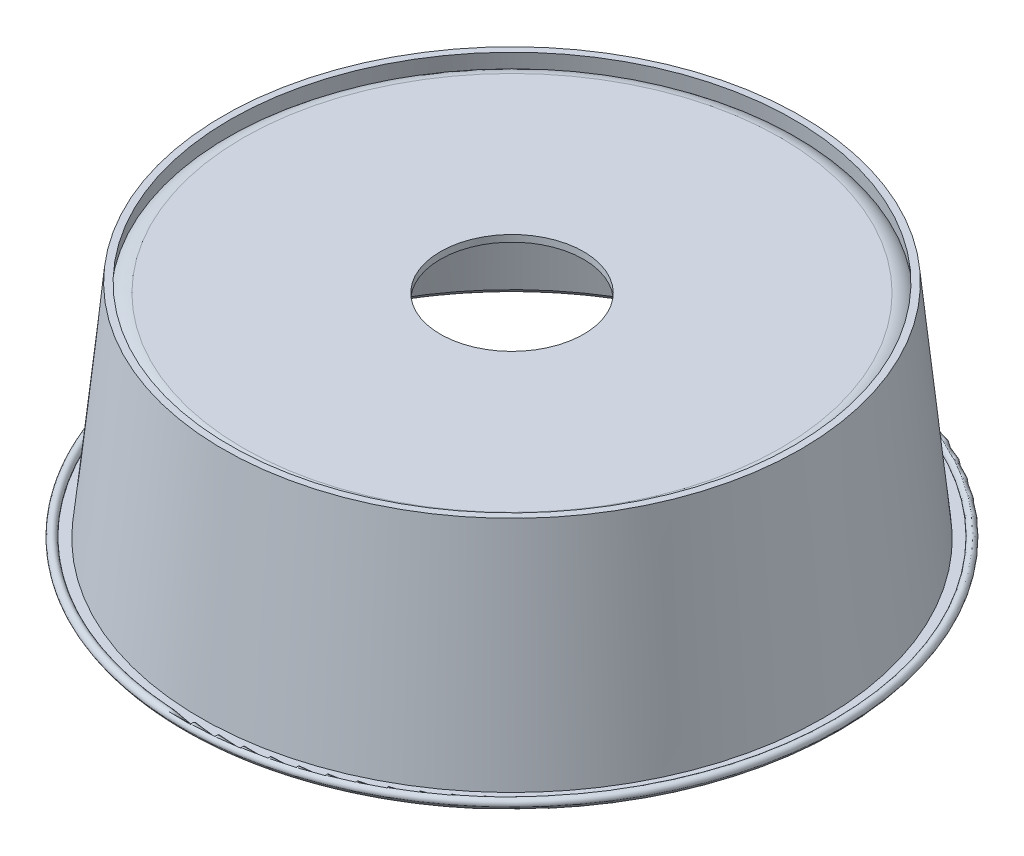
ISO-10303-21;
HEADER;
FILE_DESCRIPTION(('STEP AP214'),'2;1');
FILE_NAME('part.step','',(''),(''),'','','');
FILE_SCHEMA(('AUTOMOTIVE_DESIGN { 1 0 10303 214 1 1 1 1 }'));
ENDSEC;
DATA;
#1=APPLICATION_CONTEXT('core data for automotive mechanical design processes');
#2=APPLICATION_PROTOCOL_DEFINITION('international standard','automotive_design',2000,#1);
#3=PRODUCT_CONTEXT('',#1,'mechanical');
#4=PRODUCT('Part','Part','',(#3));
#5=PRODUCT_RELATED_PRODUCT_CATEGORY('part','',(#4));
#6=PRODUCT_DEFINITION_FORMATION('','',#4);
#7=PRODUCT_DEFINITION_CONTEXT('part definition',#1,'design');
#8=PRODUCT_DEFINITION('design','',#6,#7);
#9=PRODUCT_DEFINITION_SHAPE('','',#8);
#10=(LENGTH_UNIT() NAMED_UNIT(*) SI_UNIT(.MILLI.,.METRE.));
#11=(NAMED_UNIT(*) PLANE_ANGLE_UNIT() SI_UNIT($,.RADIAN.));
#12=(NAMED_UNIT(*) SI_UNIT($,.STERADIAN.) SOLID_ANGLE_UNIT());
#13=UNCERTAINTY_MEASURE_WITH_UNIT(LENGTH_MEASURE(1.E-05),#10,'distance_accuracy_value','');
#14=(GEOMETRIC_REPRESENTATION_CONTEXT(3) GLOBAL_UNCERTAINTY_ASSIGNED_CONTEXT((#13)) GLOBAL_UNIT_ASSIGNED_CONTEXT((#10,
#11,#12)) REPRESENTATION_CONTEXT('',''));
#15=CARTESIAN_POINT('',(0.,0.,0.));
#16=DIRECTION('',(0.,0.,1.));
#17=DIRECTION('',(1.,0.,0.));
#18=AXIS2_PLACEMENT_3D('',#15,#16,#17);
#19=CARTESIAN_POINT('',(86.7,68.7,0.));
#20=DIRECTION('',(0.,1.,0.));
#21=DIRECTION('',(-1.,0.,0.));
#22=AXIS2_PLACEMENT_3D('',#19,#20,#21);
#23=PLANE('',#22);
#24=CARTESIAN_POINT('',(0.,68.7,0.));
#25=DIRECTION('',(0.,-1.,0.));
#26=DIRECTION('',(1.,0.,0.));
#27=AXIS2_PLACEMENT_3D('',#24,#25,#26);
#28=CIRCLE('',#27,84.6896920587018);
#29=CARTESIAN_POINT('',(84.6896920587018,68.7,0.));
#30=VERTEX_POINT('',#29);
#31=EDGE_CURVE('E70',#30,#30,#28,.T.);
#32=ORIENTED_EDGE('',*,*,#31,.T.);
#33=EDGE_LOOP('',(#32));
#34=FACE_BOUND('',#33,.T.);
#35=CARTESIAN_POINT('',(0.,68.7,0.));
#36=DIRECTION('',(0.,-1.,0.));
#37=DIRECTION('',(1.,0.,0.));
#38=AXIS2_PLACEMENT_3D('',#35,#36,#37);
#39=CIRCLE('',#38,86.7);
#40=CARTESIAN_POINT('',(86.7,68.7,0.));
#41=VERTEX_POINT('',#40);
#42=EDGE_CURVE('E10',#41,#41,#39,.T.);
#43=ORIENTED_EDGE('',*,*,#42,.F.);
#44=EDGE_LOOP('',(#43));
#45=FACE_BOUND('',#44,.T.);
#46=ADVANCED_FACE('F30',(#34,#45),#23,.T.);
#47=CARTESIAN_POINT('',(0.,2.19999999999999,0.));
#48=DIRECTION('',(0.,-1.,0.));
#49=DIRECTION('',(1.,0.,0.));
#50=AXIS2_PLACEMENT_3D('',#47,#48,#49);
#51=CONICAL_SURFACE('',#50,93.4603079412982,0.101310723939109);
#52=ORIENTED_EDGE('',*,*,#42,.T.);
#53=EDGE_LOOP('',(#52));
#54=FACE_BOUND('',#53,.T.);
#55=CARTESIAN_POINT('',(0.,2.19999999999999,0.));
#56=DIRECTION('',(0.,-1.,0.));
#57=DIRECTION('',(1.,0.,0.));
#58=AXIS2_PLACEMENT_3D('',#55,#56,#57);
#59=CIRCLE('',#58,93.4603079412982);
#60=CARTESIAN_POINT('',(93.4603079412982,2.2,0.));
#61=VERTEX_POINT('',#60);
#62=EDGE_CURVE('E36',#61,#61,#59,.T.);
#63=ORIENTED_EDGE('',*,*,#62,.F.);
#64=EDGE_LOOP('',(#63));
#65=FACE_BOUND('',#64,.T.);
#66=ADVANCED_FACE('F104',(#54,#65),#51,.T.);
#67=CARTESIAN_POINT('',(93.4603079412982,2.2,0.));
#68=DIRECTION('',(0.,1.,0.));
#69=DIRECTION('',(-1.,0.,0.));
#70=AXIS2_PLACEMENT_3D('',#67,#68,#69);
#71=PLANE('',#70);
#72=ORIENTED_EDGE('',*,*,#62,.T.);
#73=EDGE_LOOP('',(#72));
#74=FACE_BOUND('',#73,.T.);
#75=CARTESIAN_POINT('',(0.,2.19999999999999,0.));
#76=DIRECTION('',(0.,-1.,0.));
#77=DIRECTION('',(1.,0.,0.));
#78=AXIS2_PLACEMENT_3D('',#75,#76,#77);
#79=CIRCLE('',#78,96.45);
#80=CARTESIAN_POINT('',(96.45,2.2,0.));
#81=VERTEX_POINT('',#80);
#82=EDGE_CURVE('E40',#81,#81,#79,.T.);
#83=ORIENTED_EDGE('',*,*,#82,.F.);
#84=EDGE_LOOP('',(#83));
#85=FACE_BOUND('',#84,.T.);
#86=ADVANCED_FACE('F108',(#74,#85),#71,.T.);
#87=CARTESIAN_POINT('',(0.,2.62647058823528,0.));
#88=DIRECTION('',(0.,-1.,0.));
#89=DIRECTION('',(1.,0.,0.));
#90=AXIS2_PLACEMENT_3D('',#87,#88,#89);
#91=TOROIDAL_SURFACE('',#90,97.65,1.27352941176471);
#92=ORIENTED_EDGE('',*,*,#82,.T.);
#93=EDGE_LOOP('',(#92));
#94=FACE_BOUND('',#93,.T.);
#95=CARTESIAN_POINT('',(0.,2.19999999999999,0.));
#96=DIRECTION('',(0.,-1.,0.));
#97=DIRECTION('',(1.,0.,0.));
#98=AXIS2_PLACEMENT_3D('',#95,#96,#97);
#99=CIRCLE('',#98,98.85);
#100=CARTESIAN_POINT('',(98.85,2.2,0.));
#101=VERTEX_POINT('',#100);
#102=EDGE_CURVE('E44',#101,#101,#99,.T.);
#103=ORIENTED_EDGE('',*,*,#102,.F.);
#104=EDGE_LOOP('',(#103));
#105=FACE_BOUND('',#104,.T.);
#106=ADVANCED_FACE('F112',(#94,#105),#91,.T.);
#107=CARTESIAN_POINT('',(0.,4.19114339855656,0.));
#108=DIRECTION('',(0.,-1.,0.));
#109=DIRECTION('',(1.,0.,0.));
#110=AXIS2_PLACEMENT_3D('',#107,#108,#109);
#111=TOROIDAL_SURFACE('',#110,95.1389820433186,4.21144943082866);
#112=ORIENTED_EDGE('',*,*,#102,.T.);
#113=EDGE_LOOP('',(#112));
#114=FACE_BOUND('',#113,.T.);
#115=CARTESIAN_POINT('',(0.,0.,0.));
#116=DIRECTION('',(0.,-1.,0.));
#117=DIRECTION('',(1.,0.,0.));
#118=AXIS2_PLACEMENT_3D('',#115,#116,#117);
#119=CIRCLE('',#118,95.552047802203);
#120=CARTESIAN_POINT('',(95.552047802203,0.,0.));
#121=VERTEX_POINT('',#120);
#122=EDGE_CURVE('E49',#121,#121,#119,.T.);
#123=ORIENTED_EDGE('',*,*,#122,.F.);
#124=EDGE_LOOP('',(#123));
#125=FACE_BOUND('',#124,.T.);
#126=ADVANCED_FACE('F118',(#114,#125),#111,.T.);
#127=CARTESIAN_POINT('',(95.052047802203,0.,0.));
#128=DIRECTION('',(0.,-1.,0.));
#129=DIRECTION('',(1.,0.,0.));
#130=AXIS2_PLACEMENT_3D('',#127,#128,#129);
#131=PLANE('',#130);
#132=ORIENTED_EDGE('',*,*,#122,.T.);
#133=EDGE_LOOP('',(#132));
#134=FACE_BOUND('',#133,.T.);
#135=CARTESIAN_POINT('',(0.,0.,0.));
#136=DIRECTION('',(0.,-1.,0.));
#137=DIRECTION('',(1.,0.,0.));
#138=AXIS2_PLACEMENT_3D('',#135,#136,#137);
#139=CIRCLE('',#138,95.052047802203);
#140=CARTESIAN_POINT('',(95.052047802203,0.,0.));
#141=VERTEX_POINT('',#140);
#142=EDGE_CURVE('E52',#141,#141,#139,.T.);
#143=ORIENTED_EDGE('',*,*,#142,.F.);
#144=EDGE_LOOP('',(#143));
#145=FACE_BOUND('',#144,.T.);
#146=ADVANCED_FACE('F122',(#134,#145),#131,.T.);
#147=CARTESIAN_POINT('',(0.,4.19114339855656,0.));
#148=DIRECTION('',(0.,-1.,0.));
#149=DIRECTION('',(1.,0.,0.));
#150=AXIS2_PLACEMENT_3D('',#147,#148,#149);
#151=TOROIDAL_SURFACE('',#150,95.1389820433186,4.19204491263424);
#152=ORIENTED_EDGE('',*,*,#142,.T.);
#153=EDGE_LOOP('',(#152));
#154=FACE_BOUND('',#153,.T.);
#155=CARTESIAN_POINT('',(0.,2.19999999999998,0.));
#156=DIRECTION('',(0.,-1.,0.));
#157=DIRECTION('',(1.,0.,0.));
#158=AXIS2_PLACEMENT_3D('',#155,#156,#157);
#159=CIRCLE('',#158,91.45);
#160=CARTESIAN_POINT('',(91.45,2.19999999999999,0.));
#161=VERTEX_POINT('',#160);
#162=EDGE_CURVE('E55',#161,#161,#159,.T.);
#163=ORIENTED_EDGE('',*,*,#162,.F.);
#164=EDGE_LOOP('',(#163));
#165=FACE_BOUND('',#164,.T.);
#166=ADVANCED_FACE('F126',(#154,#165),#151,.T.);
#167=CARTESIAN_POINT('',(0.,60.,0.));
#168=DIRECTION('',(0.,-1.,0.));
#169=DIRECTION('',(1.,0.,0.));
#170=AXIS2_PLACEMENT_3D('',#167,#168,#169);
#171=CONICAL_SURFACE('',#170,85.5741233232025,0.101310723939109);
#172=ORIENTED_EDGE('',*,*,#162,.T.);
#173=EDGE_LOOP('',(#172));
#174=FACE_BOUND('',#173,.T.);
#175=CARTESIAN_POINT('',(0.,60.,0.));
#176=DIRECTION('',(0.,-1.,0.));
#177=DIRECTION('',(1.,0.,0.));
#178=AXIS2_PLACEMENT_3D('',#175,#176,#177);
#179=CIRCLE('',#178,85.5741233232025);
#180=CARTESIAN_POINT('',(85.5741233232025,60.,0.));
#181=VERTEX_POINT('',#180);
#182=EDGE_CURVE('E58',#181,#181,#179,.T.);
#183=ORIENTED_EDGE('',*,*,#182,.F.);
#184=EDGE_LOOP('',(#183));
#185=FACE_BOUND('',#184,.T.);
#186=ADVANCED_FACE('F130',(#174,#185),#171,.F.);
#187=CARTESIAN_POINT('',(0.,57.086851930785,0.));
#188=DIRECTION('',(0.,-1.,0.));
#189=DIRECTION('',(1.,0.,0.));
#190=AXIS2_PLACEMENT_3D('',#187,#188,#189);
#191=TOROIDAL_SURFACE('',#190,79.1083906809592,7.09169445719015);
#192=ORIENTED_EDGE('',*,*,#182,.T.);
#193=EDGE_LOOP('',(#192));
#194=FACE_BOUND('',#193,.T.);
#195=CARTESIAN_POINT('',(0.,64.,0.));
#196=DIRECTION('',(0.,-1.,0.));
#197=DIRECTION('',(1.,0.,0.));
#198=AXIS2_PLACEMENT_3D('',#195,#196,#197);
#199=CIRCLE('',#198,80.6896920587018);
#200=CARTESIAN_POINT('',(80.6896920587018,64.,0.));
#201=VERTEX_POINT('',#200);
#202=EDGE_CURVE('E61',#201,#201,#199,.T.);
#203=ORIENTED_EDGE('',*,*,#202,.F.);
#204=EDGE_LOOP('',(#203));
#205=FACE_BOUND('',#204,.T.);
#206=ADVANCED_FACE('F134',(#194,#205),#191,.F.);
#207=CARTESIAN_POINT('',(0.,64.,0.));
#208=DIRECTION('',(0.,-1.,0.));
#209=DIRECTION('',(1.,0.,0.));
#210=AXIS2_PLACEMENT_3D('',#207,#208,#209);
#211=PLANE('',#210);
#212=CARTESIAN_POINT('',(0.,64.,0.));
#213=DIRECTION('',(0.,-1.,0.));
#214=DIRECTION('',(1.,0.,0.));
#215=AXIS2_PLACEMENT_3D('',#212,#213,#214);
#216=CIRCLE('',#215,21.5);
#217=CARTESIAN_POINT('',(21.5,64.,0.));
#218=VERTEX_POINT('',#217);
#219=EDGE_CURVE('E73',#218,#218,#216,.F.);
#220=ORIENTED_EDGE('',*,*,#219,.T.);
#221=EDGE_LOOP('',(#220));
#222=FACE_BOUND('',#221,.T.);
#223=ORIENTED_EDGE('',*,*,#202,.T.);
#224=EDGE_LOOP('',(#223));
#225=FACE_BOUND('',#224,.T.);
#226=ADVANCED_FACE('F87',(#222,#225),#211,.T.);
#227=CARTESIAN_POINT('',(80.6896920587018,66.,0.));
#228=DIRECTION('',(0.,1.,0.));
#229=DIRECTION('',(-1.,0.,0.));
#230=AXIS2_PLACEMENT_3D('',#227,#228,#229);
#231=PLANE('',#230);
#232=CARTESIAN_POINT('',(0.,66.,0.));
#233=DIRECTION('',(0.,1.,0.));
#234=DIRECTION('',(-1.,0.,0.));
#235=AXIS2_PLACEMENT_3D('',#232,#233,#234);
#236=CIRCLE('',#235,21.5);
#237=CARTESIAN_POINT('',(-21.5,66.,0.));
#238=VERTEX_POINT('',#237);
#239=EDGE_CURVE('E76',#238,#238,#236,.T.);
#240=ORIENTED_EDGE('',*,*,#239,.F.);
#241=EDGE_LOOP('',(#240));
#242=FACE_BOUND('',#241,.T.);
#243=CARTESIAN_POINT('',(0.,66.,0.));
#244=DIRECTION('',(0.,-1.,0.));
#245=DIRECTION('',(1.,0.,0.));
#246=AXIS2_PLACEMENT_3D('',#243,#244,#245);
#247=CIRCLE('',#246,80.6896920587018);
#248=CARTESIAN_POINT('',(80.6896920587018,66.,0.));
#249=VERTEX_POINT('',#248);
#250=EDGE_CURVE('E64',#249,#249,#247,.T.);
#251=ORIENTED_EDGE('',*,*,#250,.F.);
#252=EDGE_LOOP('',(#251));
#253=FACE_BOUND('',#252,.T.);
#254=ADVANCED_FACE('F83',(#242,#253),#231,.T.);
#255=CARTESIAN_POINT('',(0.,58.9256089862893,0.));
#256=DIRECTION('',(0.,-1.,0.));
#257=DIRECTION('',(1.,0.,0.));
#258=AXIS2_PLACEMENT_3D('',#255,#256,#257);
#259=TOROIDAL_SURFACE('',#258,80.1945940287418,7.09169445719015);
#260=ORIENTED_EDGE('',*,*,#250,.T.);
#261=EDGE_LOOP('',(#260));
#262=FACE_BOUND('',#261,.T.);
#263=CARTESIAN_POINT('',(0.,63.9794898262371,0.));
#264=DIRECTION('',(0.,-1.,0.));
#265=DIRECTION('',(1.,0.,0.));
#266=AXIS2_PLACEMENT_3D('',#263,#264,#265);
#267=CIRCLE('',#266,85.1695732980201);
#268=CARTESIAN_POINT('',(85.1695732980201,63.9794898262372,0.));
#269=VERTEX_POINT('',#268);
#270=EDGE_CURVE('E67',#269,#269,#267,.T.);
#271=ORIENTED_EDGE('',*,*,#270,.F.);
#272=EDGE_LOOP('',(#271));
#273=FACE_BOUND('',#272,.T.);
#274=ADVANCED_FACE('F86',(#262,#273),#259,.T.);
#275=CARTESIAN_POINT('',(0.,68.7,0.));
#276=DIRECTION('',(0.,-1.,0.));
#277=DIRECTION('',(1.,0.,0.));
#278=AXIS2_PLACEMENT_3D('',#275,#276,#277);
#279=CONICAL_SURFACE('',#278,84.6896920587018,0.10131072393911);
#280=ORIENTED_EDGE('',*,*,#270,.T.);
#281=EDGE_LOOP('',(#280));
#282=FACE_BOUND('',#281,.T.);
#283=ORIENTED_EDGE('',*,*,#31,.F.);
#284=EDGE_LOOP('',(#283));
#285=FACE_BOUND('',#284,.T.);
#286=ADVANCED_FACE('F93',(#282,#285),#279,.F.);
#287=CARTESIAN_POINT('',(0.,3.18881681795692,0.));
#288=DIRECTION('',(0.,1.,0.));
#289=DIRECTION('',(-1.,0.,0.));
#290=AXIS2_PLACEMENT_3D('',#287,#288,#289);
#291=CYLINDRICAL_SURFACE('',#290,21.5);
#292=ORIENTED_EDGE('',*,*,#239,.T.);
#293=EDGE_LOOP('',(#292));
#294=FACE_BOUND('',#293,.T.);
#295=ORIENTED_EDGE('',*,*,#219,.F.);
#296=EDGE_LOOP('',(#295));
#297=FACE_BOUND('',#296,.T.);
#298=ADVANCED_FACE('F80',(#294,#297),#291,.F.);
#299=CLOSED_SHELL('',(#46,#66,#86,#106,#126,#146,#166,#186,#206,#226,#254,#274,#286,#298));
#300=MANIFOLD_SOLID_BREP('B2',#299);
#301=ADVANCED_BREP_SHAPE_REPRESENTATION('',(#18,#300),#14);
#302=SHAPE_DEFINITION_REPRESENTATION(#9,#301);
ENDSEC;
END-ISO-10303-21;
